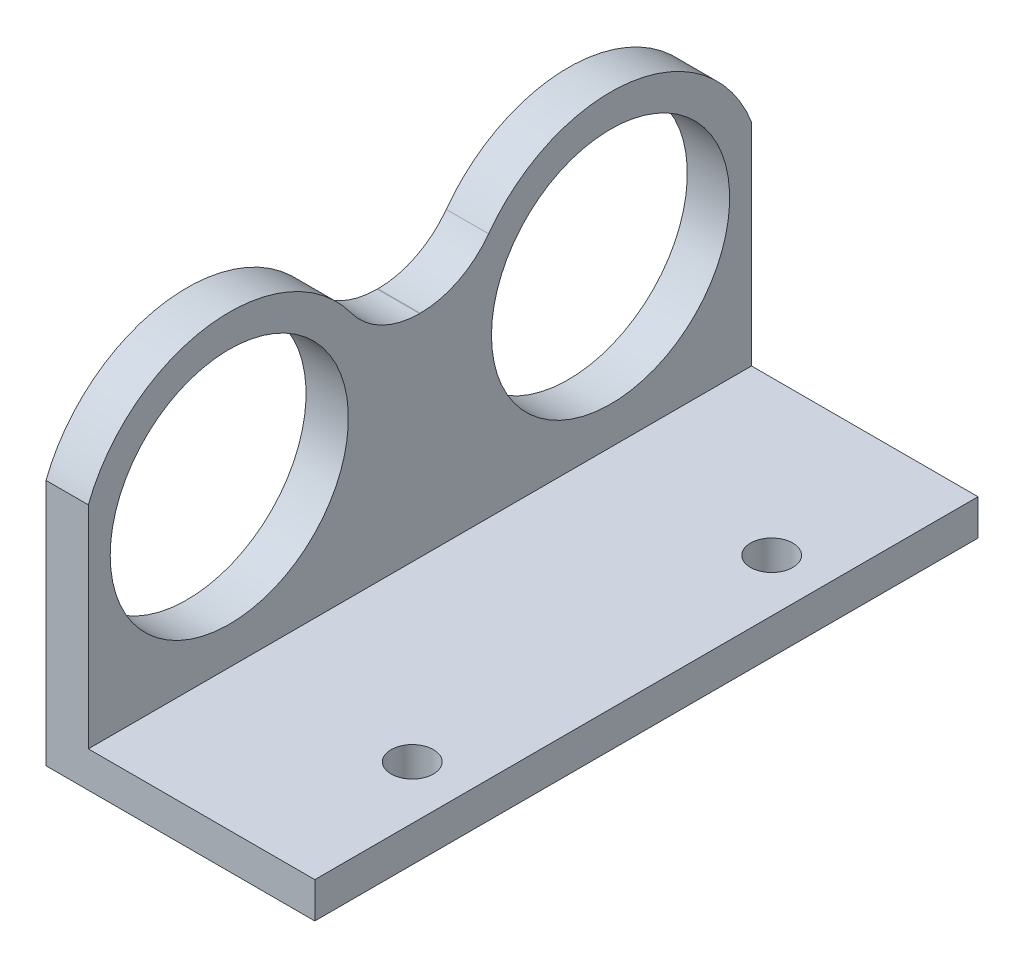
ISO-10303-21;
HEADER;
FILE_DESCRIPTION(('STEP AP214'),'2;1');
FILE_NAME('part.step','',(''),(''),'','','');
FILE_SCHEMA(('AUTOMOTIVE_DESIGN { 1 0 10303 214 1 1 1 1 }'));
ENDSEC;
DATA;
#1=APPLICATION_CONTEXT('core data for automotive mechanical design processes');
#2=APPLICATION_PROTOCOL_DEFINITION('international standard','automotive_design',2000,#1);
#3=PRODUCT_CONTEXT('',#1,'mechanical');
#4=PRODUCT('Part','Part','',(#3));
#5=PRODUCT_RELATED_PRODUCT_CATEGORY('part','',(#4));
#6=PRODUCT_DEFINITION_FORMATION('','',#4);
#7=PRODUCT_DEFINITION_CONTEXT('part definition',#1,'design');
#8=PRODUCT_DEFINITION('design','',#6,#7);
#9=PRODUCT_DEFINITION_SHAPE('','',#8);
#10=(LENGTH_UNIT() NAMED_UNIT(*) SI_UNIT(.MILLI.,.METRE.));
#11=(NAMED_UNIT(*) PLANE_ANGLE_UNIT() SI_UNIT($,.RADIAN.));
#12=(NAMED_UNIT(*) SI_UNIT($,.STERADIAN.) SOLID_ANGLE_UNIT());
#13=UNCERTAINTY_MEASURE_WITH_UNIT(LENGTH_MEASURE(1.E-05),#10,'distance_accuracy_value','');
#14=(GEOMETRIC_REPRESENTATION_CONTEXT(3) GLOBAL_UNCERTAINTY_ASSIGNED_CONTEXT((#13)) GLOBAL_UNIT_ASSIGNED_CONTEXT((#10,
#11,#12)) REPRESENTATION_CONTEXT('',''));
#15=CARTESIAN_POINT('',(0.,0.,0.));
#16=DIRECTION('',(0.,0.,1.));
#17=DIRECTION('',(1.,0.,0.));
#18=AXIS2_PLACEMENT_3D('',#15,#16,#17);
#19=CARTESIAN_POINT('',(0.,2.54,0.));
#20=DIRECTION('',(0.,-1.,0.));
#21=DIRECTION('',(0.,0.,-1.));
#22=AXIS2_PLACEMENT_3D('',#19,#20,#21);
#23=PLANE('',#22);
#24=CARTESIAN_POINT('',(15.2744974745142,2.54,-10.6838845200085));
#25=DIRECTION('',(0.,1.,0.));
#26=DIRECTION('',(0.,0.,1.));
#27=AXIS2_PLACEMENT_3D('',#24,#25,#26);
#28=CIRCLE('',#27,1.5);
#29=CARTESIAN_POINT('',(15.2744974745142,2.54,-9.18388452000847));
#30=VERTEX_POINT('',#29);
#31=EDGE_CURVE('E350',#30,#30,#28,.T.);
#32=ORIENTED_EDGE('',*,*,#31,.F.);
#33=EDGE_LOOP('',(#32));
#34=FACE_BOUND('',#33,.T.);
#35=CARTESIAN_POINT('',(15.33,2.54,-36.0959739841432));
#36=DIRECTION('',(0.,1.,0.));
#37=DIRECTION('',(0.,0.,1.));
#38=AXIS2_PLACEMENT_3D('',#35,#36,#37);
#39=CIRCLE('',#38,1.5);
#40=CARTESIAN_POINT('',(15.33,2.54,-34.5959739841432));
#41=VERTEX_POINT('',#40);
#42=EDGE_CURVE('E355',#41,#41,#39,.T.);
#43=ORIENTED_EDGE('',*,*,#42,.F.);
#44=EDGE_LOOP('',(#43));
#45=FACE_BOUND('',#44,.T.);
#46=DIRECTION('',(0.,0.,-1.));
#47=VECTOR('',#46,1.);
#48=CARTESIAN_POINT('',(3.,2.54,0.));
#49=LINE('',#48,#47);
#50=CARTESIAN_POINT('',(3.,2.54,0.));
#51=VERTEX_POINT('',#50);
#52=CARTESIAN_POINT('',(3.,2.54,-47.));
#53=VERTEX_POINT('',#52);
#54=EDGE_CURVE('E54',#51,#53,#49,.T.);
#55=ORIENTED_EDGE('',*,*,#54,.F.);
#56=DIRECTION('',(1.,0.,0.));
#57=VECTOR('',#56,1.);
#58=CARTESIAN_POINT('',(0.,2.54,0.));
#59=LINE('',#58,#57);
#60=CARTESIAN_POINT('',(19.05,2.54,0.));
#61=VERTEX_POINT('',#60);
#62=EDGE_CURVE('E92',#51,#61,#59,.T.);
#63=ORIENTED_EDGE('',*,*,#62,.T.);
#64=DIRECTION('',(0.,0.,-1.));
#65=VECTOR('',#64,1.);
#66=CARTESIAN_POINT('',(19.05,2.54,0.));
#67=LINE('',#66,#65);
#68=CARTESIAN_POINT('',(19.05,2.54,-47.));
#69=VERTEX_POINT('',#68);
#70=EDGE_CURVE('E60',#61,#69,#67,.T.);
#71=ORIENTED_EDGE('',*,*,#70,.T.);
#72=DIRECTION('',(-1.,0.,0.));
#73=VECTOR('',#72,1.);
#74=CARTESIAN_POINT('',(0.,2.54,-47.));
#75=LINE('',#74,#73);
#76=EDGE_CURVE('E104',#69,#53,#75,.T.);
#77=ORIENTED_EDGE('',*,*,#76,.T.);
#78=EDGE_LOOP('',(#55,#63,#71,#77));
#79=FACE_BOUND('',#78,.T.);
#80=ADVANCED_FACE('F39',(#34,#45,#79),#23,.F.);
#81=CARTESIAN_POINT('',(0.,2.54,0.));
#82=DIRECTION('',(1.,0.,0.));
#83=DIRECTION('',(0.,0.,-1.));
#84=AXIS2_PLACEMENT_3D('',#81,#82,#83);
#85=PLANE('',#84);
#86=DIRECTION('',(0.,0.,1.));
#87=VECTOR('',#86,1.);
#88=CARTESIAN_POINT('',(0.,0.,0.));
#89=LINE('',#88,#87);
#90=CARTESIAN_POINT('',(0.,0.,-47.));
#91=VERTEX_POINT('',#90);
#92=CARTESIAN_POINT('',(0.,0.,0.));
#93=VERTEX_POINT('',#92);
#94=EDGE_CURVE('E100',#91,#93,#89,.T.);
#95=ORIENTED_EDGE('',*,*,#94,.T.);
#96=DIRECTION('',(0.,-1.,0.));
#97=VECTOR('',#96,1.);
#98=CARTESIAN_POINT('',(0.,2.54,0.));
#99=LINE('',#98,#97);
#100=CARTESIAN_POINT('',(0.,17.5164720815611,0.));
#101=VERTEX_POINT('',#100);
#102=EDGE_CURVE('E11',#101,#93,#99,.T.);
#103=ORIENTED_EDGE('',*,*,#102,.F.);
#104=CARTESIAN_POINT('',(0.,13.63,-9.99000000000001));
#105=DIRECTION('',(-1.,0.,0.));
#106=DIRECTION('',(0.,0.,1.));
#107=AXIS2_PLACEMENT_3D('',#104,#105,#106);
#108=CIRCLE('',#107,10.7193640315437);
#109=CARTESIAN_POINT('',(0.,19.9685600690316,-18.6345023854489));
#110=VERTEX_POINT('',#109);
#111=EDGE_CURVE('E134',#110,#101,#108,.F.);
#112=ORIENTED_EDGE('',*,*,#111,.F.);
#113=CARTESIAN_POINT('',(0.,23.516472081561,-23.473130326441));
#114=DIRECTION('',(-1.,0.,0.));
#115=DIRECTION('',(0.,0.,1.));
#116=AXIS2_PLACEMENT_3D('',#113,#114,#115);
#117=CIRCLE('',#116,6.);
#118=CARTESIAN_POINT('',(0.,17.516472081561,-23.473130326441));
#119=VERTEX_POINT('',#118);
#120=EDGE_CURVE('E195',#110,#119,#117,.F.);
#121=ORIENTED_EDGE('',*,*,#120,.T.);
#122=DIRECTION('',(0.,0.,1.));
#123=VECTOR('',#122,1.);
#124=CARTESIAN_POINT('',(0.,17.516472081561,0.));
#125=LINE('',#124,#123);
#126=CARTESIAN_POINT('',(0.,17.516472081561,-23.526869673559));
#127=VERTEX_POINT('',#126);
#128=EDGE_CURVE('E188',#127,#119,#125,.T.);
#129=ORIENTED_EDGE('',*,*,#128,.F.);
#130=CARTESIAN_POINT('',(0.,23.516472081561,-23.526869673559));
#131=DIRECTION('',(-1.,0.,0.));
#132=DIRECTION('',(0.,0.,1.));
#133=AXIS2_PLACEMENT_3D('',#130,#131,#132);
#134=CIRCLE('',#133,6.);
#135=CARTESIAN_POINT('',(0.,19.9685600690316,-28.3654976145511));
#136=VERTEX_POINT('',#135);
#137=EDGE_CURVE('E177',#127,#136,#134,.F.);
#138=ORIENTED_EDGE('',*,*,#137,.T.);
#139=CARTESIAN_POINT('',(0.,13.63,-37.01));
#140=DIRECTION('',(-1.,0.,0.));
#141=DIRECTION('',(0.,0.,1.));
#142=AXIS2_PLACEMENT_3D('',#139,#140,#141);
#143=CIRCLE('',#142,10.7193640315437);
#144=CARTESIAN_POINT('',(0.,17.5164720815611,-47.));
#145=VERTEX_POINT('',#144);
#146=EDGE_CURVE('E103',#136,#145,#143,.T.);
#147=ORIENTED_EDGE('',*,*,#146,.T.);
#148=DIRECTION('',(0.,-1.,0.));
#149=VECTOR('',#148,1.);
#150=CARTESIAN_POINT('',(0.,2.54,-47.));
#151=LINE('',#150,#149);
#152=EDGE_CURVE('E85',#145,#91,#151,.T.);
#153=ORIENTED_EDGE('',*,*,#152,.T.);
#154=EDGE_LOOP('',(#95,#103,#112,#121,#129,#138,#147,#153));
#155=FACE_BOUND('',#154,.T.);
#156=CARTESIAN_POINT('',(0.,13.63,-9.99000000000001));
#157=DIRECTION('',(-1.,0.,0.));
#158=DIRECTION('',(0.,0.,1.));
#159=AXIS2_PLACEMENT_3D('',#156,#157,#158);
#160=CIRCLE('',#159,8.44);
#161=CARTESIAN_POINT('',(0.,13.63,-1.55000000000001));
#162=VERTEX_POINT('',#161);
#163=EDGE_CURVE('E218',#162,#162,#160,.F.);
#164=ORIENTED_EDGE('',*,*,#163,.T.);
#165=EDGE_LOOP('',(#164));
#166=FACE_BOUND('',#165,.T.);
#167=CARTESIAN_POINT('',(0.,13.63,-37.01));
#168=DIRECTION('',(-1.,0.,0.));
#169=DIRECTION('',(0.,0.,1.));
#170=AXIS2_PLACEMENT_3D('',#167,#168,#169);
#171=CIRCLE('',#170,8.44);
#172=CARTESIAN_POINT('',(0.,13.63,-28.57));
#173=VERTEX_POINT('',#172);
#174=EDGE_CURVE('E190',#173,#173,#171,.T.);
#175=ORIENTED_EDGE('',*,*,#174,.F.);
#176=EDGE_LOOP('',(#175));
#177=FACE_BOUND('',#176,.T.);
#178=ADVANCED_FACE('F41',(#155,#166,#177),#85,.F.);
#179=CARTESIAN_POINT('',(0.,2.54,0.));
#180=DIRECTION('',(0.,0.,-1.));
#181=DIRECTION('',(-1.,0.,0.));
#182=AXIS2_PLACEMENT_3D('',#179,#180,#181);
#183=PLANE('',#182);
#184=DIRECTION('',(1.,0.,0.));
#185=VECTOR('',#184,1.);
#186=CARTESIAN_POINT('',(0.,0.,0.));
#187=LINE('',#186,#185);
#188=CARTESIAN_POINT('',(19.05,0.,0.));
#189=VERTEX_POINT('',#188);
#190=EDGE_CURVE('E107',#93,#189,#187,.T.);
#191=ORIENTED_EDGE('',*,*,#190,.T.);
#192=DIRECTION('',(0.,-1.,0.));
#193=VECTOR('',#192,1.);
#194=CARTESIAN_POINT('',(19.05,2.54,0.));
#195=LINE('',#194,#193);
#196=EDGE_CURVE('E47',#61,#189,#195,.T.);
#197=ORIENTED_EDGE('',*,*,#196,.F.);
#198=ORIENTED_EDGE('',*,*,#62,.F.);
#199=DIRECTION('',(0.,1.,0.));
#200=VECTOR('',#199,1.);
#201=CARTESIAN_POINT('',(3.,0.,0.));
#202=LINE('',#201,#200);
#203=CARTESIAN_POINT('',(3.,17.5164720815611,0.));
#204=VERTEX_POINT('',#203);
#205=EDGE_CURVE('E207',#51,#204,#202,.T.);
#206=ORIENTED_EDGE('',*,*,#205,.T.);
#207=DIRECTION('',(-1.,0.,0.));
#208=VECTOR('',#207,1.);
#209=CARTESIAN_POINT('',(3.,17.5164720815611,0.));
#210=LINE('',#209,#208);
#211=EDGE_CURVE('E129',#204,#101,#210,.T.);
#212=ORIENTED_EDGE('',*,*,#211,.T.);
#213=ORIENTED_EDGE('',*,*,#102,.T.);
#214=EDGE_LOOP('',(#191,#197,#198,#206,#212,#213));
#215=FACE_BOUND('',#214,.T.);
#216=ADVANCED_FACE('F123',(#215),#183,.F.);
#217=CARTESIAN_POINT('',(19.05,2.54,0.));
#218=DIRECTION('',(-1.,0.,0.));
#219=DIRECTION('',(0.,0.,1.));
#220=AXIS2_PLACEMENT_3D('',#217,#218,#219);
#221=PLANE('',#220);
#222=DIRECTION('',(0.,0.,-1.));
#223=VECTOR('',#222,1.);
#224=CARTESIAN_POINT('',(19.05,0.,0.));
#225=LINE('',#224,#223);
#226=CARTESIAN_POINT('',(19.05,0.,-47.));
#227=VERTEX_POINT('',#226);
#228=EDGE_CURVE('E93',#189,#227,#225,.T.);
#229=ORIENTED_EDGE('',*,*,#228,.T.);
#230=DIRECTION('',(0.,-1.,0.));
#231=VECTOR('',#230,1.);
#232=CARTESIAN_POINT('',(19.05,2.54,-47.));
#233=LINE('',#232,#231);
#234=EDGE_CURVE('E88',#69,#227,#233,.T.);
#235=ORIENTED_EDGE('',*,*,#234,.F.);
#236=ORIENTED_EDGE('',*,*,#70,.F.);
#237=ORIENTED_EDGE('',*,*,#196,.T.);
#238=EDGE_LOOP('',(#229,#235,#236,#237));
#239=FACE_BOUND('',#238,.T.);
#240=ADVANCED_FACE('F121',(#239),#221,.F.);
#241=CARTESIAN_POINT('',(0.,2.54,-47.));
#242=DIRECTION('',(0.,0.,1.));
#243=DIRECTION('',(1.,0.,0.));
#244=AXIS2_PLACEMENT_3D('',#241,#242,#243);
#245=PLANE('',#244);
#246=DIRECTION('',(-1.,0.,0.));
#247=VECTOR('',#246,1.);
#248=CARTESIAN_POINT('',(0.,0.,-47.));
#249=LINE('',#248,#247);
#250=EDGE_CURVE('E80',#227,#91,#249,.T.);
#251=ORIENTED_EDGE('',*,*,#250,.T.);
#252=ORIENTED_EDGE('',*,*,#152,.F.);
#253=DIRECTION('',(-1.,0.,0.));
#254=VECTOR('',#253,1.);
#255=CARTESIAN_POINT('',(3.,17.5164720815611,-47.));
#256=LINE('',#255,#254);
#257=CARTESIAN_POINT('',(3.,17.5164720815611,-47.));
#258=VERTEX_POINT('',#257);
#259=EDGE_CURVE('E183',#258,#145,#256,.T.);
#260=ORIENTED_EDGE('',*,*,#259,.F.);
#261=DIRECTION('',(0.,1.,0.));
#262=VECTOR('',#261,1.);
#263=CARTESIAN_POINT('',(3.,0.,-47.));
#264=LINE('',#263,#262);
#265=EDGE_CURVE('E206',#53,#258,#264,.T.);
#266=ORIENTED_EDGE('',*,*,#265,.F.);
#267=ORIENTED_EDGE('',*,*,#76,.F.);
#268=ORIENTED_EDGE('',*,*,#234,.T.);
#269=EDGE_LOOP('',(#251,#252,#260,#266,#267,#268));
#270=FACE_BOUND('',#269,.T.);
#271=ADVANCED_FACE('F82',(#270),#245,.F.);
#272=CARTESIAN_POINT('',(0.,0.,0.));
#273=DIRECTION('',(0.,-1.,0.));
#274=DIRECTION('',(0.,0.,-1.));
#275=AXIS2_PLACEMENT_3D('',#272,#273,#274);
#276=PLANE('',#275);
#277=CARTESIAN_POINT('',(15.2744974745142,0.,-10.6838845200085));
#278=DIRECTION('',(0.,1.,0.));
#279=DIRECTION('',(0.,0.,1.));
#280=AXIS2_PLACEMENT_3D('',#277,#278,#279);
#281=CIRCLE('',#280,1.5);
#282=CARTESIAN_POINT('',(15.2744974745142,0.,-9.18388452000847));
#283=VERTEX_POINT('',#282);
#284=EDGE_CURVE('E220',#283,#283,#281,.T.);
#285=ORIENTED_EDGE('',*,*,#284,.T.);
#286=EDGE_LOOP('',(#285));
#287=FACE_BOUND('',#286,.T.);
#288=CARTESIAN_POINT('',(15.33,0.,-36.0959739841432));
#289=DIRECTION('',(0.,1.,0.));
#290=DIRECTION('',(0.,0.,1.));
#291=AXIS2_PLACEMENT_3D('',#288,#289,#290);
#292=CIRCLE('',#291,1.5);
#293=CARTESIAN_POINT('',(15.33,0.,-34.5959739841432));
#294=VERTEX_POINT('',#293);
#295=EDGE_CURVE('E351',#294,#294,#292,.T.);
#296=ORIENTED_EDGE('',*,*,#295,.T.);
#297=EDGE_LOOP('',(#296));
#298=FACE_BOUND('',#297,.T.);
#299=ORIENTED_EDGE('',*,*,#94,.F.);
#300=ORIENTED_EDGE('',*,*,#250,.F.);
#301=ORIENTED_EDGE('',*,*,#228,.F.);
#302=ORIENTED_EDGE('',*,*,#190,.F.);
#303=EDGE_LOOP('',(#299,#300,#301,#302));
#304=FACE_BOUND('',#303,.T.);
#305=ADVANCED_FACE('F106',(#287,#298,#304),#276,.T.);
#306=CARTESIAN_POINT('',(3.,17.516472081561,0.));
#307=DIRECTION('',(0.,-1.,0.));
#308=DIRECTION('',(0.,0.,-1.));
#309=AXIS2_PLACEMENT_3D('',#306,#307,#308);
#310=PLANE('',#309);
#311=ORIENTED_EDGE('',*,*,#128,.T.);
#312=DIRECTION('',(-1.,0.,0.));
#313=VECTOR('',#312,1.);
#314=CARTESIAN_POINT('',(3.,17.516472081561,-23.473130326441));
#315=LINE('',#314,#313);
#316=CARTESIAN_POINT('',(3.,17.516472081561,-23.473130326441));
#317=VERTEX_POINT('',#316);
#318=EDGE_CURVE('E108',#317,#119,#315,.T.);
#319=ORIENTED_EDGE('',*,*,#318,.F.);
#320=DIRECTION('',(0.,0.,1.));
#321=VECTOR('',#320,1.);
#322=CARTESIAN_POINT('',(3.,17.516472081561,0.));
#323=LINE('',#322,#321);
#324=CARTESIAN_POINT('',(3.,17.516472081561,-23.526869673559));
#325=VERTEX_POINT('',#324);
#326=EDGE_CURVE('E365',#325,#317,#323,.T.);
#327=ORIENTED_EDGE('',*,*,#326,.F.);
#328=DIRECTION('',(-1.,0.,0.));
#329=VECTOR('',#328,1.);
#330=CARTESIAN_POINT('',(3.,17.516472081561,-23.526869673559));
#331=LINE('',#330,#329);
#332=EDGE_CURVE('E155',#325,#127,#331,.T.);
#333=ORIENTED_EDGE('',*,*,#332,.T.);
#334=EDGE_LOOP('',(#311,#319,#327,#333));
#335=FACE_BOUND('',#334,.T.);
#336=ADVANCED_FACE('F245',(#335),#310,.F.);
#337=CARTESIAN_POINT('',(3.,23.516472081561,-23.473130326441));
#338=DIRECTION('',(-1.,0.,0.));
#339=DIRECTION('',(0.,0.,1.));
#340=AXIS2_PLACEMENT_3D('',#337,#338,#339);
#341=CYLINDRICAL_SURFACE('',#340,6.);
#342=ORIENTED_EDGE('',*,*,#120,.F.);
#343=DIRECTION('',(-1.,0.,0.));
#344=VECTOR('',#343,1.);
#345=CARTESIAN_POINT('',(3.,19.9685600690316,-18.6345023854489));
#346=LINE('',#345,#344);
#347=CARTESIAN_POINT('',(3.,19.9685600690316,-18.6345023854489));
#348=VERTEX_POINT('',#347);
#349=EDGE_CURVE('E112',#348,#110,#346,.T.);
#350=ORIENTED_EDGE('',*,*,#349,.F.);
#351=CARTESIAN_POINT('',(3.,23.516472081561,-23.473130326441));
#352=DIRECTION('',(-1.,0.,0.));
#353=DIRECTION('',(0.,0.,1.));
#354=AXIS2_PLACEMENT_3D('',#351,#352,#353);
#355=CIRCLE('',#354,6.);
#356=EDGE_CURVE('E202',#348,#317,#355,.F.);
#357=ORIENTED_EDGE('',*,*,#356,.T.);
#358=ORIENTED_EDGE('',*,*,#318,.T.);
#359=EDGE_LOOP('',(#342,#350,#357,#358));
#360=FACE_BOUND('',#359,.T.);
#361=ADVANCED_FACE('F283',(#360),#341,.F.);
#362=CARTESIAN_POINT('',(3.,13.63,-9.99000000000001));
#363=DIRECTION('',(-1.,0.,0.));
#364=DIRECTION('',(0.,0.,1.));
#365=AXIS2_PLACEMENT_3D('',#362,#363,#364);
#366=CYLINDRICAL_SURFACE('',#365,10.7193640315437);
#367=ORIENTED_EDGE('',*,*,#111,.T.);
#368=ORIENTED_EDGE('',*,*,#211,.F.);
#369=CARTESIAN_POINT('',(3.,13.63,-9.99000000000001));
#370=DIRECTION('',(-1.,0.,0.));
#371=DIRECTION('',(0.,0.,1.));
#372=AXIS2_PLACEMENT_3D('',#369,#370,#371);
#373=CIRCLE('',#372,10.7193640315437);
#374=EDGE_CURVE('E215',#348,#204,#373,.F.);
#375=ORIENTED_EDGE('',*,*,#374,.F.);
#376=ORIENTED_EDGE('',*,*,#349,.T.);
#377=EDGE_LOOP('',(#367,#368,#375,#376));
#378=FACE_BOUND('',#377,.T.);
#379=ADVANCED_FACE('F291',(#378),#366,.T.);
#380=CARTESIAN_POINT('',(3.,13.63,-37.01));
#381=DIRECTION('',(-1.,0.,0.));
#382=DIRECTION('',(0.,0.,1.));
#383=AXIS2_PLACEMENT_3D('',#380,#381,#382);
#384=CYLINDRICAL_SURFACE('',#383,10.7193640315437);
#385=ORIENTED_EDGE('',*,*,#146,.F.);
#386=DIRECTION('',(-1.,0.,0.));
#387=VECTOR('',#386,1.);
#388=CARTESIAN_POINT('',(3.,19.9685600690316,-28.3654976145511));
#389=LINE('',#388,#387);
#390=CARTESIAN_POINT('',(3.,19.9685600690316,-28.3654976145511));
#391=VERTEX_POINT('',#390);
#392=EDGE_CURVE('E175',#391,#136,#389,.T.);
#393=ORIENTED_EDGE('',*,*,#392,.F.);
#394=CARTESIAN_POINT('',(3.,13.63,-37.01));
#395=DIRECTION('',(-1.,0.,0.));
#396=DIRECTION('',(0.,0.,1.));
#397=AXIS2_PLACEMENT_3D('',#394,#395,#396);
#398=CIRCLE('',#397,10.7193640315437);
#399=EDGE_CURVE('E209',#391,#258,#398,.T.);
#400=ORIENTED_EDGE('',*,*,#399,.T.);
#401=ORIENTED_EDGE('',*,*,#259,.T.);
#402=EDGE_LOOP('',(#385,#393,#400,#401));
#403=FACE_BOUND('',#402,.T.);
#404=ADVANCED_FACE('F185',(#403),#384,.T.);
#405=CARTESIAN_POINT('',(3.,13.63,-37.01));
#406=DIRECTION('',(-1.,0.,0.));
#407=DIRECTION('',(0.,0.,1.));
#408=AXIS2_PLACEMENT_3D('',#405,#406,#407);
#409=CYLINDRICAL_SURFACE('',#408,8.44);
#410=CARTESIAN_POINT('',(3.,13.63,-37.01));
#411=DIRECTION('',(-1.,0.,0.));
#412=DIRECTION('',(0.,0.,1.));
#413=AXIS2_PLACEMENT_3D('',#410,#411,#412);
#414=CIRCLE('',#413,8.44);
#415=CARTESIAN_POINT('',(3.,13.63,-28.57));
#416=VERTEX_POINT('',#415);
#417=EDGE_CURVE('E362',#416,#416,#414,.T.);
#418=ORIENTED_EDGE('',*,*,#417,.F.);
#419=EDGE_LOOP('',(#418));
#420=FACE_BOUND('',#419,.T.);
#421=ORIENTED_EDGE('',*,*,#174,.T.);
#422=EDGE_LOOP('',(#421));
#423=FACE_BOUND('',#422,.T.);
#424=ADVANCED_FACE('F224',(#420,#423),#409,.F.);
#425=CARTESIAN_POINT('',(3.,13.63,-9.99000000000001));
#426=DIRECTION('',(-1.,0.,0.));
#427=DIRECTION('',(0.,0.,1.));
#428=AXIS2_PLACEMENT_3D('',#425,#426,#427);
#429=CYLINDRICAL_SURFACE('',#428,8.44);
#430=CARTESIAN_POINT('',(3.,13.63,-9.99000000000001));
#431=DIRECTION('',(-1.,0.,0.));
#432=DIRECTION('',(0.,0.,1.));
#433=AXIS2_PLACEMENT_3D('',#430,#431,#432);
#434=CIRCLE('',#433,8.44);
#435=CARTESIAN_POINT('',(3.,13.63,-1.55000000000001));
#436=VERTEX_POINT('',#435);
#437=EDGE_CURVE('E196',#436,#436,#434,.F.);
#438=ORIENTED_EDGE('',*,*,#437,.T.);
#439=EDGE_LOOP('',(#438));
#440=FACE_BOUND('',#439,.T.);
#441=ORIENTED_EDGE('',*,*,#163,.F.);
#442=EDGE_LOOP('',(#441));
#443=FACE_BOUND('',#442,.T.);
#444=ADVANCED_FACE('F242',(#440,#443),#429,.F.);
#445=CARTESIAN_POINT('',(3.,23.516472081561,-23.526869673559));
#446=DIRECTION('',(-1.,0.,0.));
#447=DIRECTION('',(0.,0.,1.));
#448=AXIS2_PLACEMENT_3D('',#445,#446,#447);
#449=CYLINDRICAL_SURFACE('',#448,6.);
#450=ORIENTED_EDGE('',*,*,#137,.F.);
#451=ORIENTED_EDGE('',*,*,#332,.F.);
#452=CARTESIAN_POINT('',(3.,23.516472081561,-23.526869673559));
#453=DIRECTION('',(-1.,0.,0.));
#454=DIRECTION('',(0.,0.,1.));
#455=AXIS2_PLACEMENT_3D('',#452,#453,#454);
#456=CIRCLE('',#455,6.);
#457=EDGE_CURVE('E179',#325,#391,#456,.F.);
#458=ORIENTED_EDGE('',*,*,#457,.T.);
#459=ORIENTED_EDGE('',*,*,#392,.T.);
#460=EDGE_LOOP('',(#450,#451,#458,#459));
#461=FACE_BOUND('',#460,.T.);
#462=ADVANCED_FACE('F176',(#461),#449,.F.);
#463=CARTESIAN_POINT('',(3.,0.,0.));
#464=DIRECTION('',(-1.,0.,0.));
#465=DIRECTION('',(0.,0.,1.));
#466=AXIS2_PLACEMENT_3D('',#463,#464,#465);
#467=PLANE('',#466);
#468=ORIENTED_EDGE('',*,*,#437,.F.);
#469=EDGE_LOOP('',(#468));
#470=FACE_BOUND('',#469,.T.);
#471=ORIENTED_EDGE('',*,*,#417,.T.);
#472=EDGE_LOOP('',(#471));
#473=FACE_BOUND('',#472,.T.);
#474=ORIENTED_EDGE('',*,*,#326,.T.);
#475=ORIENTED_EDGE('',*,*,#356,.F.);
#476=ORIENTED_EDGE('',*,*,#374,.T.);
#477=ORIENTED_EDGE('',*,*,#205,.F.);
#478=ORIENTED_EDGE('',*,*,#54,.T.);
#479=ORIENTED_EDGE('',*,*,#265,.T.);
#480=ORIENTED_EDGE('',*,*,#399,.F.);
#481=ORIENTED_EDGE('',*,*,#457,.F.);
#482=EDGE_LOOP('',(#474,#475,#476,#477,#478,#479,#480,#481));
#483=FACE_BOUND('',#482,.T.);
#484=ADVANCED_FACE('F205',(#470,#473,#483),#467,.F.);
#485=CARTESIAN_POINT('',(15.33,0.,-36.0959739841432));
#486=DIRECTION('',(0.,1.,0.));
#487=DIRECTION('',(0.,0.,1.));
#488=AXIS2_PLACEMENT_3D('',#485,#486,#487);
#489=CYLINDRICAL_SURFACE('',#488,1.5);
#490=ORIENTED_EDGE('',*,*,#295,.F.);
#491=EDGE_LOOP('',(#490));
#492=FACE_BOUND('',#491,.T.);
#493=ORIENTED_EDGE('',*,*,#42,.T.);
#494=EDGE_LOOP('',(#493));
#495=FACE_BOUND('',#494,.T.);
#496=ADVANCED_FACE('F327',(#492,#495),#489,.F.);
#497=CARTESIAN_POINT('',(15.2744974745142,0.,-10.6838845200085));
#498=DIRECTION('',(0.,1.,0.));
#499=DIRECTION('',(0.,0.,1.));
#500=AXIS2_PLACEMENT_3D('',#497,#498,#499);
#501=CYLINDRICAL_SURFACE('',#500,1.5);
#502=ORIENTED_EDGE('',*,*,#284,.F.);
#503=EDGE_LOOP('',(#502));
#504=FACE_BOUND('',#503,.T.);
#505=ORIENTED_EDGE('',*,*,#31,.T.);
#506=EDGE_LOOP('',(#505));
#507=FACE_BOUND('',#506,.T.);
#508=ADVANCED_FACE('F336',(#504,#507),#501,.F.);
#509=CLOSED_SHELL('',(#80,#178,#216,#240,#271,#305,#336,#361,#379,#404,#424,#444,#462,#484,#496,#508));
#510=MANIFOLD_SOLID_BREP('B2',#509);
#511=ADVANCED_BREP_SHAPE_REPRESENTATION('',(#18,#510),#14);
#512=SHAPE_DEFINITION_REPRESENTATION(#9,#511);
ENDSEC;
END-ISO-10303-21;
